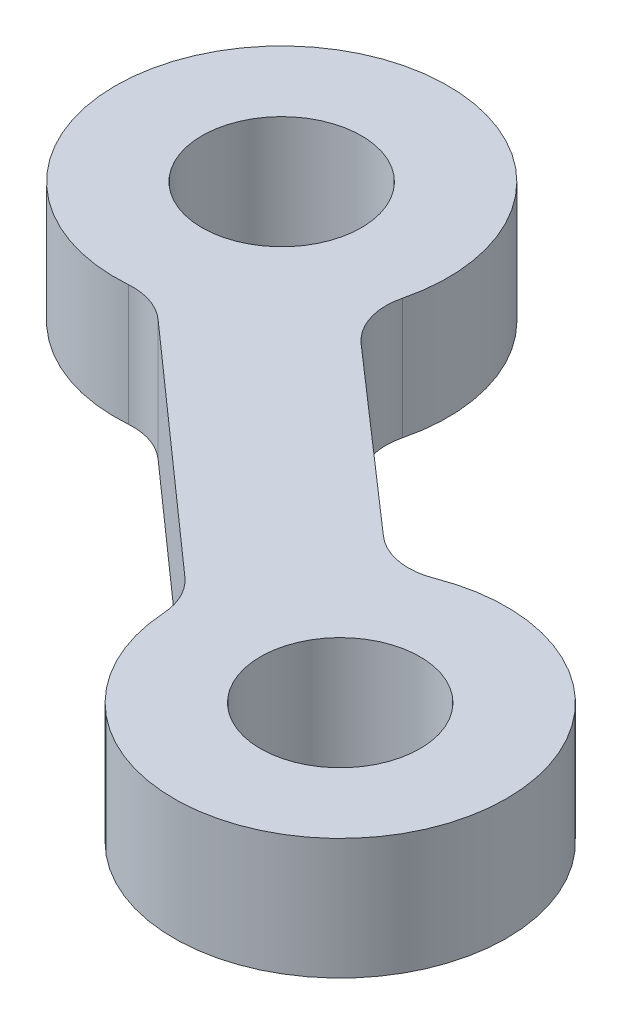
ISO-10303-21;
HEADER;
FILE_DESCRIPTION(('STEP AP214'),'2;1');
FILE_NAME('part.step','',(''),(''),'','','');
FILE_SCHEMA(('AUTOMOTIVE_DESIGN { 1 0 10303 214 1 1 1 1 }'));
ENDSEC;
DATA;
#1=APPLICATION_CONTEXT('core data for automotive mechanical design processes');
#2=APPLICATION_PROTOCOL_DEFINITION('international standard','automotive_design',2000,#1);
#3=PRODUCT_CONTEXT('',#1,'mechanical');
#4=PRODUCT('Part','Part','',(#3));
#5=PRODUCT_RELATED_PRODUCT_CATEGORY('part','',(#4));
#6=PRODUCT_DEFINITION_FORMATION('','',#4);
#7=PRODUCT_DEFINITION_CONTEXT('part definition',#1,'design');
#8=PRODUCT_DEFINITION('design','',#6,#7);
#9=PRODUCT_DEFINITION_SHAPE('','',#8);
#10=(LENGTH_UNIT() NAMED_UNIT(*) SI_UNIT(.MILLI.,.METRE.));
#11=(NAMED_UNIT(*) PLANE_ANGLE_UNIT() SI_UNIT($,.RADIAN.));
#12=(NAMED_UNIT(*) SI_UNIT($,.STERADIAN.) SOLID_ANGLE_UNIT());
#13=UNCERTAINTY_MEASURE_WITH_UNIT(LENGTH_MEASURE(1.E-05),#10,'distance_accuracy_value','');
#14=(GEOMETRIC_REPRESENTATION_CONTEXT(3) GLOBAL_UNCERTAINTY_ASSIGNED_CONTEXT((#13)) GLOBAL_UNIT_ASSIGNED_CONTEXT((#10,
#11,#12)) REPRESENTATION_CONTEXT('',''));
#15=CARTESIAN_POINT('',(0.,0.,0.));
#16=DIRECTION('',(0.,0.,1.));
#17=DIRECTION('',(1.,0.,0.));
#18=AXIS2_PLACEMENT_3D('',#15,#16,#17);
#19=CARTESIAN_POINT('',(97.9868806190565,4.,-33.5833584269257));
#20=DIRECTION('',(0.,-1.,0.));
#21=DIRECTION('',(0.,0.,-1.));
#22=AXIS2_PLACEMENT_3D('',#19,#20,#21);
#23=CYLINDRICAL_SURFACE('',#22,5.50000000000001);
#24=CARTESIAN_POINT('',(97.9868806190565,0.,-33.5833584269257));
#25=DIRECTION('',(0.,-1.,0.));
#26=DIRECTION('',(0.,0.,-1.));
#27=AXIS2_PLACEMENT_3D('',#24,#25,#26);
#28=CIRCLE('',#27,5.50000000000001);
#29=CARTESIAN_POINT('',(95.9828217037036,0.,-38.7052475182468));
#30=VERTEX_POINT('',#29);
#31=CARTESIAN_POINT('',(92.4979516243383,0.,-33.2345626543851));
#32=VERTEX_POINT('',#31);
#33=EDGE_CURVE('E130',#30,#32,#28,.T.);
#34=ORIENTED_EDGE('',*,*,#33,.F.);
#35=DIRECTION('',(0.,-1.,0.));
#36=VECTOR('',#35,1.);
#37=CARTESIAN_POINT('',(95.9828217037036,4.,-38.7052475182468));
#38=LINE('',#37,#36);
#39=CARTESIAN_POINT('',(95.9828217037036,4.,-38.7052475182468));
#40=VERTEX_POINT('',#39);
#41=EDGE_CURVE('E11',#40,#30,#38,.T.);
#42=ORIENTED_EDGE('',*,*,#41,.F.);
#43=CARTESIAN_POINT('',(97.9868806190565,4.,-33.5833584269257));
#44=DIRECTION('',(0.,-1.,0.));
#45=DIRECTION('',(0.,0.,-1.));
#46=AXIS2_PLACEMENT_3D('',#43,#44,#45);
#47=CIRCLE('',#46,5.50000000000001);
#48=CARTESIAN_POINT('',(92.4979516243383,4.,-33.2345626543851));
#49=VERTEX_POINT('',#48);
#50=EDGE_CURVE('E151',#40,#49,#47,.T.);
#51=ORIENTED_EDGE('',*,*,#50,.T.);
#52=DIRECTION('',(0.,-1.,0.));
#53=VECTOR('',#52,1.);
#54=CARTESIAN_POINT('',(92.4979516243383,4.,-33.2345626543851));
#55=LINE('',#54,#53);
#56=EDGE_CURVE('E36',#49,#32,#55,.T.);
#57=ORIENTED_EDGE('',*,*,#56,.T.);
#58=EDGE_LOOP('',(#34,#42,#51,#57));
#59=FACE_BOUND('',#58,.T.);
#60=ADVANCED_FACE('F33',(#59),#23,.T.);
#61=CARTESIAN_POINT('',(95.2540730072116,4.,-40.5677526423636));
#62=DIRECTION('',(0.,-1.,0.));
#63=DIRECTION('',(0.,0.,-1.));
#64=AXIS2_PLACEMENT_3D('',#61,#62,#63);
#65=CYLINDRICAL_SURFACE('',#64,2.00000000000001);
#66=CARTESIAN_POINT('',(95.2540730072116,0.,-40.5677526423636));
#67=DIRECTION('',(0.,1.,0.));
#68=DIRECTION('',(0.,0.,1.));
#69=AXIS2_PLACEMENT_3D('',#66,#67,#68);
#70=CIRCLE('',#69,2.00000000000001);
#71=CARTESIAN_POINT('',(93.9374818242984,0.,-39.0622335767005));
#72=VERTEX_POINT('',#71);
#73=EDGE_CURVE('E149',#72,#30,#70,.T.);
#74=ORIENTED_EDGE('',*,*,#73,.F.);
#75=DIRECTION('',(0.,-1.,0.));
#76=VECTOR('',#75,1.);
#77=CARTESIAN_POINT('',(93.9374818242984,4.,-39.0622335767005));
#78=LINE('',#77,#76);
#79=CARTESIAN_POINT('',(93.9374818242984,4.,-39.0622335767005));
#80=VERTEX_POINT('',#79);
#81=EDGE_CURVE('E42',#80,#72,#78,.T.);
#82=ORIENTED_EDGE('',*,*,#81,.F.);
#83=CARTESIAN_POINT('',(95.2540730072116,4.,-40.5677526423636));
#84=DIRECTION('',(0.,1.,0.));
#85=DIRECTION('',(0.,0.,1.));
#86=AXIS2_PLACEMENT_3D('',#83,#84,#85);
#87=CIRCLE('',#86,2.00000000000001);
#88=EDGE_CURVE('E120',#80,#40,#87,.T.);
#89=ORIENTED_EDGE('',*,*,#88,.T.);
#90=ORIENTED_EDGE('',*,*,#41,.T.);
#91=EDGE_LOOP('',(#74,#82,#89,#90));
#92=FACE_BOUND('',#91,.T.);
#93=ADVANCED_FACE('F163',(#92),#65,.F.);
#94=CARTESIAN_POINT('',(88.0534392912902,4.,-44.2078864585077));
#95=DIRECTION('',(0.658295591456619,0.,-0.752759532831555));
#96=DIRECTION('',(-0.752759532831555,0.,-0.658295591456619));
#97=AXIS2_PLACEMENT_3D('',#94,#95,#96);
#98=PLANE('',#97);
#99=DIRECTION('',(0.752759532831555,0.,0.658295591456619));
#100=VECTOR('',#99,1.);
#101=CARTESIAN_POINT('',(88.0534392912902,0.,-44.2078864585077));
#102=LINE('',#101,#100);
#103=CARTESIAN_POINT('',(88.0534392912902,0.,-44.2078864585077));
#104=VERTEX_POINT('',#103);
#105=EDGE_CURVE('E107',#104,#72,#102,.T.);
#106=ORIENTED_EDGE('',*,*,#105,.F.);
#107=DIRECTION('',(0.,-1.,0.));
#108=VECTOR('',#107,1.);
#109=CARTESIAN_POINT('',(88.0534392912902,4.,-44.2078864585077));
#110=LINE('',#109,#108);
#111=CARTESIAN_POINT('',(88.0534392912902,4.,-44.2078864585077));
#112=VERTEX_POINT('',#111);
#113=EDGE_CURVE('E102',#112,#104,#110,.T.);
#114=ORIENTED_EDGE('',*,*,#113,.F.);
#115=DIRECTION('',(0.752759532831555,0.,0.658295591456619));
#116=VECTOR('',#115,1.);
#117=CARTESIAN_POINT('',(88.0534392912902,4.,-44.2078864585077));
#118=LINE('',#117,#116);
#119=EDGE_CURVE('E105',#112,#80,#118,.T.);
#120=ORIENTED_EDGE('',*,*,#119,.T.);
#121=ORIENTED_EDGE('',*,*,#81,.T.);
#122=EDGE_LOOP('',(#106,#114,#120,#121));
#123=FACE_BOUND('',#122,.T.);
#124=ADVANCED_FACE('F104',(#123),#98,.T.);
#125=CARTESIAN_POINT('',(89.3700304742034,4.,-45.7134055241708));
#126=DIRECTION('',(0.,-1.,0.));
#127=DIRECTION('',(0.,0.,-1.));
#128=AXIS2_PLACEMENT_3D('',#125,#126,#127);
#129=CYLINDRICAL_SURFACE('',#128,2.);
#130=CARTESIAN_POINT('',(89.3700304742034,0.,-45.7134055241708));
#131=DIRECTION('',(0.,1.,0.));
#132=DIRECTION('',(0.,0.,1.));
#133=AXIS2_PLACEMENT_3D('',#130,#131,#132);
#134=CIRCLE('',#133,2.);
#135=CARTESIAN_POINT('',(87.4301696317101,0.,-46.2001702638152));
#136=VERTEX_POINT('',#135);
#137=EDGE_CURVE('E146',#136,#104,#134,.T.);
#138=ORIENTED_EDGE('',*,*,#137,.F.);
#139=DIRECTION('',(0.,-1.,0.));
#140=VECTOR('',#139,1.);
#141=CARTESIAN_POINT('',(87.4301696317101,4.,-46.2001702638152));
#142=LINE('',#141,#140);
#143=CARTESIAN_POINT('',(87.4301696317101,4.,-46.2001702638152));
#144=VERTEX_POINT('',#143);
#145=EDGE_CURVE('E112',#144,#136,#142,.T.);
#146=ORIENTED_EDGE('',*,*,#145,.F.);
#147=CARTESIAN_POINT('',(89.3700304742034,4.,-45.7134055241708));
#148=DIRECTION('',(0.,1.,0.));
#149=DIRECTION('',(0.,0.,1.));
#150=AXIS2_PLACEMENT_3D('',#147,#148,#149);
#151=CIRCLE('',#150,2.);
#152=EDGE_CURVE('E118',#144,#112,#151,.T.);
#153=ORIENTED_EDGE('',*,*,#152,.T.);
#154=ORIENTED_EDGE('',*,*,#113,.T.);
#155=EDGE_LOOP('',(#138,#146,#153,#154));
#156=FACE_BOUND('',#155,.T.);
#157=ADVANCED_FACE('F122',(#156),#129,.F.);
#158=CARTESIAN_POINT('',(82.0955523148534,4.,-47.5387732978373));
#159=DIRECTION('',(0.,-1.,0.));
#160=DIRECTION('',(0.,0.,-1.));
#161=AXIS2_PLACEMENT_3D('',#158,#159,#160);
#162=CYLINDRICAL_SURFACE('',#161,5.50000000000001);
#163=CARTESIAN_POINT('',(82.0955523148534,0.,-47.5387732978373));
#164=DIRECTION('',(0.,-1.,0.));
#165=DIRECTION('',(0.,0.,-1.));
#166=AXIS2_PLACEMENT_3D('',#163,#164,#165);
#167=CIRCLE('',#166,5.50000000000001);
#168=CARTESIAN_POINT('',(82.5101698124519,0.,-42.0544235341292));
#169=VERTEX_POINT('',#168);
#170=EDGE_CURVE('E143',#169,#136,#167,.T.);
#171=ORIENTED_EDGE('',*,*,#170,.F.);
#172=DIRECTION('',(0.,-1.,0.));
#173=VECTOR('',#172,1.);
#174=CARTESIAN_POINT('',(82.5101698124519,4.,-42.0544235341292));
#175=LINE('',#174,#173);
#176=CARTESIAN_POINT('',(82.5101698124519,4.,-42.0544235341292));
#177=VERTEX_POINT('',#176);
#178=EDGE_CURVE('E155',#177,#169,#175,.T.);
#179=ORIENTED_EDGE('',*,*,#178,.F.);
#180=CARTESIAN_POINT('',(82.0955523148534,4.,-47.5387732978373));
#181=DIRECTION('',(0.,-1.,0.));
#182=DIRECTION('',(0.,0.,-1.));
#183=AXIS2_PLACEMENT_3D('',#180,#181,#182);
#184=CIRCLE('',#183,5.50000000000001);
#185=EDGE_CURVE('E123',#177,#144,#184,.T.);
#186=ORIENTED_EDGE('',*,*,#185,.T.);
#187=ORIENTED_EDGE('',*,*,#145,.T.);
#188=EDGE_LOOP('',(#171,#179,#186,#187));
#189=FACE_BOUND('',#188,.T.);
#190=ADVANCED_FACE('F176',(#189),#162,.T.);
#191=CARTESIAN_POINT('',(82.6609398115787,4.,-40.0601145291444));
#192=DIRECTION('',(0.,-1.,0.));
#193=DIRECTION('',(0.,0.,-1.));
#194=AXIS2_PLACEMENT_3D('',#191,#192,#193);
#195=CYLINDRICAL_SURFACE('',#194,2.);
#196=CARTESIAN_POINT('',(82.6609398115787,0.,-40.0601145291444));
#197=DIRECTION('',(0.,1.,0.));
#198=DIRECTION('',(0.,0.,1.));
#199=AXIS2_PLACEMENT_3D('',#196,#197,#198);
#200=CIRCLE('',#199,2.);
#201=CARTESIAN_POINT('',(83.9878087778209,0.,-41.5565832880643));
#202=VERTEX_POINT('',#201);
#203=EDGE_CURVE('E140',#202,#169,#200,.T.);
#204=ORIENTED_EDGE('',*,*,#203,.F.);
#205=DIRECTION('',(0.,-1.,0.));
#206=VECTOR('',#205,1.);
#207=CARTESIAN_POINT('',(83.9878087778209,4.,-41.5565832880643));
#208=LINE('',#207,#206);
#209=CARTESIAN_POINT('',(83.9878087778209,4.,-41.5565832880643));
#210=VERTEX_POINT('',#209);
#211=EDGE_CURVE('E157',#210,#202,#208,.T.);
#212=ORIENTED_EDGE('',*,*,#211,.F.);
#213=CARTESIAN_POINT('',(82.6609398115787,4.,-40.0601145291444));
#214=DIRECTION('',(0.,1.,0.));
#215=DIRECTION('',(0.,0.,1.));
#216=AXIS2_PLACEMENT_3D('',#213,#214,#215);
#217=CIRCLE('',#216,2.);
#218=EDGE_CURVE('E125',#210,#177,#217,.T.);
#219=ORIENTED_EDGE('',*,*,#218,.T.);
#220=ORIENTED_EDGE('',*,*,#178,.T.);
#221=EDGE_LOOP('',(#204,#212,#219,#220));
#222=FACE_BOUND('',#221,.T.);
#223=ADVANCED_FACE('F179',(#222),#195,.F.);
#224=CARTESIAN_POINT('',(91.8288464106831,4.,-34.6041965869265));
#225=DIRECTION('',(-0.66343448312114,0.,0.748234379459929));
#226=DIRECTION('',(0.748234379459929,0.,0.66343448312114));
#227=AXIS2_PLACEMENT_3D('',#224,#225,#226);
#228=PLANE('',#227);
#229=DIRECTION('',(-0.748234379459929,0.,-0.66343448312114));
#230=VECTOR('',#229,1.);
#231=CARTESIAN_POINT('',(91.8288464106831,0.,-34.6041965869265));
#232=LINE('',#231,#230);
#233=CARTESIAN_POINT('',(91.8288464106831,0.,-34.6041965869265));
#234=VERTEX_POINT('',#233);
#235=EDGE_CURVE('E137',#234,#202,#232,.T.);
#236=ORIENTED_EDGE('',*,*,#235,.F.);
#237=DIRECTION('',(0.,-1.,0.));
#238=VECTOR('',#237,1.);
#239=CARTESIAN_POINT('',(91.8288464106831,4.,-34.6041965869265));
#240=LINE('',#239,#238);
#241=CARTESIAN_POINT('',(91.8288464106831,4.,-34.6041965869265));
#242=VERTEX_POINT('',#241);
#243=EDGE_CURVE('E158',#242,#234,#240,.T.);
#244=ORIENTED_EDGE('',*,*,#243,.F.);
#245=DIRECTION('',(-0.748234379459929,0.,-0.66343448312114));
#246=VECTOR('',#245,1.);
#247=CARTESIAN_POINT('',(91.8288464106831,4.,-34.6041965869265));
#248=LINE('',#247,#246);
#249=EDGE_CURVE('E225',#242,#210,#248,.T.);
#250=ORIENTED_EDGE('',*,*,#249,.T.);
#251=ORIENTED_EDGE('',*,*,#211,.T.);
#252=EDGE_LOOP('',(#236,#244,#250,#251));
#253=FACE_BOUND('',#252,.T.);
#254=ADVANCED_FACE('F183',(#253),#228,.T.);
#255=CARTESIAN_POINT('',(90.5019774444408,4.,-33.1077278280066));
#256=DIRECTION('',(0.,-1.,0.));
#257=DIRECTION('',(0.,0.,-1.));
#258=AXIS2_PLACEMENT_3D('',#255,#256,#257);
#259=CYLINDRICAL_SURFACE('',#258,2.00000000000001);
#260=CARTESIAN_POINT('',(90.5019774444408,0.,-33.1077278280066));
#261=DIRECTION('',(0.,1.,0.));
#262=DIRECTION('',(0.,0.,1.));
#263=AXIS2_PLACEMENT_3D('',#260,#261,#262);
#264=CIRCLE('',#263,2.00000000000001);
#265=EDGE_CURVE('E133',#32,#234,#264,.T.);
#266=ORIENTED_EDGE('',*,*,#265,.F.);
#267=ORIENTED_EDGE('',*,*,#56,.F.);
#268=CARTESIAN_POINT('',(90.5019774444408,4.,-33.1077278280066));
#269=DIRECTION('',(0.,1.,0.));
#270=DIRECTION('',(0.,0.,1.));
#271=AXIS2_PLACEMENT_3D('',#268,#269,#270);
#272=CIRCLE('',#271,2.00000000000001);
#273=EDGE_CURVE('E223',#49,#242,#272,.T.);
#274=ORIENTED_EDGE('',*,*,#273,.T.);
#275=ORIENTED_EDGE('',*,*,#243,.T.);
#276=EDGE_LOOP('',(#266,#267,#274,#275));
#277=FACE_BOUND('',#276,.T.);
#278=ADVANCED_FACE('F160',(#277),#259,.F.);
#279=CARTESIAN_POINT('',(97.9868806190565,4.,-33.5833584269257));
#280=DIRECTION('',(0.,-1.,0.));
#281=DIRECTION('',(0.,0.,-1.));
#282=AXIS2_PLACEMENT_3D('',#279,#280,#281);
#283=PLANE('',#282);
#284=CARTESIAN_POINT('',(97.9868806190565,4.,-33.5833584269257));
#285=DIRECTION('',(0.,-1.,0.));
#286=DIRECTION('',(0.,0.,1.));
#287=AXIS2_PLACEMENT_3D('',#284,#285,#286);
#288=CIRCLE('',#287,2.63749999999999);
#289=CARTESIAN_POINT('',(97.9868806190565,4.,-30.9458584269257));
#290=VERTEX_POINT('',#289);
#291=EDGE_CURVE('E210',#290,#290,#288,.T.);
#292=ORIENTED_EDGE('',*,*,#291,.T.);
#293=EDGE_LOOP('',(#292));
#294=FACE_BOUND('',#293,.T.);
#295=CARTESIAN_POINT('',(82.0955523148534,4.,-47.5387732978373));
#296=DIRECTION('',(0.,-1.,0.));
#297=DIRECTION('',(0.,0.,1.));
#298=AXIS2_PLACEMENT_3D('',#295,#296,#297);
#299=CIRCLE('',#298,2.63750000000001);
#300=CARTESIAN_POINT('',(82.0955523148534,4.,-44.9012732978373));
#301=VERTEX_POINT('',#300);
#302=EDGE_CURVE('E134',#301,#301,#299,.T.);
#303=ORIENTED_EDGE('',*,*,#302,.T.);
#304=EDGE_LOOP('',(#303));
#305=FACE_BOUND('',#304,.T.);
#306=ORIENTED_EDGE('',*,*,#50,.F.);
#307=ORIENTED_EDGE('',*,*,#88,.F.);
#308=ORIENTED_EDGE('',*,*,#119,.F.);
#309=ORIENTED_EDGE('',*,*,#152,.F.);
#310=ORIENTED_EDGE('',*,*,#185,.F.);
#311=ORIENTED_EDGE('',*,*,#218,.F.);
#312=ORIENTED_EDGE('',*,*,#249,.F.);
#313=ORIENTED_EDGE('',*,*,#273,.F.);
#314=EDGE_LOOP('',(#306,#307,#308,#309,#310,#311,#312,#313));
#315=FACE_BOUND('',#314,.T.);
#316=ADVANCED_FACE('F116',(#294,#305,#315),#283,.F.);
#317=CARTESIAN_POINT('',(97.9868806190565,0.,-33.5833584269257));
#318=DIRECTION('',(0.,-1.,0.));
#319=DIRECTION('',(0.,0.,-1.));
#320=AXIS2_PLACEMENT_3D('',#317,#318,#319);
#321=PLANE('',#320);
#322=CARTESIAN_POINT('',(97.9868806190565,0.,-33.5833584269257));
#323=DIRECTION('',(0.,-1.,0.));
#324=DIRECTION('',(0.,0.,1.));
#325=AXIS2_PLACEMENT_3D('',#322,#323,#324);
#326=CIRCLE('',#325,2.63749999999999);
#327=CARTESIAN_POINT('',(97.9868806190565,0.,-30.9458584269257));
#328=VERTEX_POINT('',#327);
#329=EDGE_CURVE('E213',#328,#328,#326,.T.);
#330=ORIENTED_EDGE('',*,*,#329,.F.);
#331=EDGE_LOOP('',(#330));
#332=FACE_BOUND('',#331,.T.);
#333=CARTESIAN_POINT('',(82.0955523148534,0.,-47.5387732978373));
#334=DIRECTION('',(0.,-1.,0.));
#335=DIRECTION('',(0.,0.,1.));
#336=AXIS2_PLACEMENT_3D('',#333,#334,#335);
#337=CIRCLE('',#336,2.63750000000001);
#338=CARTESIAN_POINT('',(82.0955523148534,0.,-44.9012732978373));
#339=VERTEX_POINT('',#338);
#340=EDGE_CURVE('E215',#339,#339,#337,.T.);
#341=ORIENTED_EDGE('',*,*,#340,.F.);
#342=EDGE_LOOP('',(#341));
#343=FACE_BOUND('',#342,.T.);
#344=ORIENTED_EDGE('',*,*,#33,.T.);
#345=ORIENTED_EDGE('',*,*,#265,.T.);
#346=ORIENTED_EDGE('',*,*,#235,.T.);
#347=ORIENTED_EDGE('',*,*,#203,.T.);
#348=ORIENTED_EDGE('',*,*,#170,.T.);
#349=ORIENTED_EDGE('',*,*,#137,.T.);
#350=ORIENTED_EDGE('',*,*,#105,.T.);
#351=ORIENTED_EDGE('',*,*,#73,.T.);
#352=EDGE_LOOP('',(#344,#345,#346,#347,#348,#349,#350,#351));
#353=FACE_BOUND('',#352,.T.);
#354=ADVANCED_FACE('F162',(#332,#343,#353),#321,.T.);
#355=CARTESIAN_POINT('',(82.0955523148534,4.,-47.5387732978373));
#356=DIRECTION('',(0.,-1.,0.));
#357=DIRECTION('',(0.,0.,-1.));
#358=AXIS2_PLACEMENT_3D('',#355,#356,#357);
#359=CYLINDRICAL_SURFACE('',#358,2.63750000000001);
#360=ORIENTED_EDGE('',*,*,#302,.F.);
#361=EDGE_LOOP('',(#360));
#362=FACE_BOUND('',#361,.T.);
#363=ORIENTED_EDGE('',*,*,#340,.T.);
#364=EDGE_LOOP('',(#363));
#365=FACE_BOUND('',#364,.T.);
#366=ADVANCED_FACE('F195',(#362,#365),#359,.F.);
#367=CARTESIAN_POINT('',(97.9868806190565,4.,-33.5833584269257));
#368=DIRECTION('',(0.,-1.,0.));
#369=DIRECTION('',(0.,0.,-1.));
#370=AXIS2_PLACEMENT_3D('',#367,#368,#369);
#371=CYLINDRICAL_SURFACE('',#370,2.63749999999999);
#372=ORIENTED_EDGE('',*,*,#291,.F.);
#373=EDGE_LOOP('',(#372));
#374=FACE_BOUND('',#373,.T.);
#375=ORIENTED_EDGE('',*,*,#329,.T.);
#376=EDGE_LOOP('',(#375));
#377=FACE_BOUND('',#376,.T.);
#378=ADVANCED_FACE('F202',(#374,#377),#371,.F.);
#379=CLOSED_SHELL('',(#60,#93,#124,#157,#190,#223,#254,#278,#316,#354,#366,#378));
#380=MANIFOLD_SOLID_BREP('B2',#379);
#381=ADVANCED_BREP_SHAPE_REPRESENTATION('',(#18,#380),#14);
#382=SHAPE_DEFINITION_REPRESENTATION(#9,#381);
ENDSEC;
END-ISO-10303-21;
